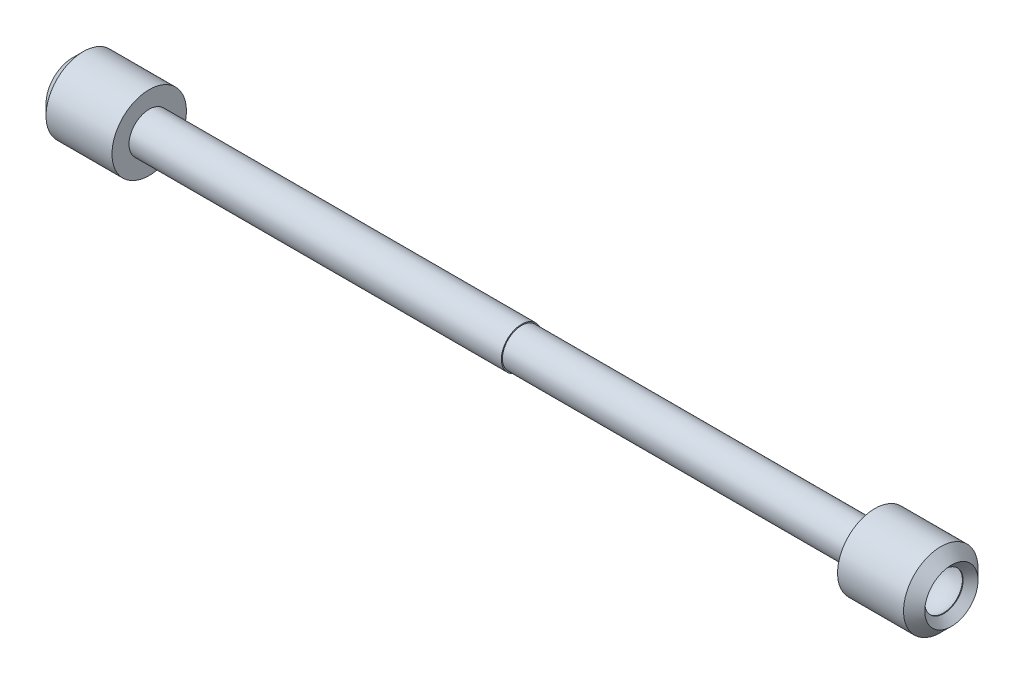
ISO-10303-21;
HEADER;
FILE_DESCRIPTION(('STEP AP214'),'2;1');
FILE_NAME('part.step','',(''),(''),'','','');
FILE_SCHEMA(('AUTOMOTIVE_DESIGN { 1 0 10303 214 1 1 1 1 }'));
ENDSEC;
DATA;
#1=APPLICATION_CONTEXT('core data for automotive mechanical design processes');
#2=APPLICATION_PROTOCOL_DEFINITION('international standard','automotive_design',2000,#1);
#3=PRODUCT_CONTEXT('',#1,'mechanical');
#4=PRODUCT('Part','Part','',(#3));
#5=PRODUCT_RELATED_PRODUCT_CATEGORY('part','',(#4));
#6=PRODUCT_DEFINITION_FORMATION('','',#4);
#7=PRODUCT_DEFINITION_CONTEXT('part definition',#1,'design');
#8=PRODUCT_DEFINITION('design','',#6,#7);
#9=PRODUCT_DEFINITION_SHAPE('','',#8);
#10=(LENGTH_UNIT() NAMED_UNIT(*) SI_UNIT(.MILLI.,.METRE.));
#11=(NAMED_UNIT(*) PLANE_ANGLE_UNIT() SI_UNIT($,.RADIAN.));
#12=(NAMED_UNIT(*) SI_UNIT($,.STERADIAN.) SOLID_ANGLE_UNIT());
#13=UNCERTAINTY_MEASURE_WITH_UNIT(LENGTH_MEASURE(1.E-05),#10,'distance_accuracy_value','');
#14=(GEOMETRIC_REPRESENTATION_CONTEXT(3) GLOBAL_UNCERTAINTY_ASSIGNED_CONTEXT((#13)) GLOBAL_UNIT_ASSIGNED_CONTEXT((#10,
#11,#12)) REPRESENTATION_CONTEXT('',''));
#15=CARTESIAN_POINT('',(0.,0.,0.));
#16=DIRECTION('',(0.,0.,1.));
#17=DIRECTION('',(1.,0.,0.));
#18=AXIS2_PLACEMENT_3D('',#15,#16,#17);
#19=CARTESIAN_POINT('',(192.,0.,0.));
#20=DIRECTION('',(1.,0.,0.));
#21=DIRECTION('',(0.,0.,-1.));
#22=AXIS2_PLACEMENT_3D('',#19,#20,#21);
#23=CYLINDRICAL_SURFACE('',#22,9.);
#24=CARTESIAN_POINT('',(198.5,0.,0.));
#25=DIRECTION('',(1.,0.,0.));
#26=DIRECTION('',(0.,0.,-1.));
#27=AXIS2_PLACEMENT_3D('',#24,#25,#26);
#28=CIRCLE('',#27,9.);
#29=CARTESIAN_POINT('',(198.5,0.,-9.));
#30=VERTEX_POINT('',#29);
#31=EDGE_CURVE('E10',#30,#30,#28,.T.);
#32=ORIENTED_EDGE('',*,*,#31,.T.);
#33=EDGE_LOOP('',(#32));
#34=FACE_BOUND('',#33,.T.);
#35=CARTESIAN_POINT('',(198.174675786449,0.,0.));
#36=DIRECTION('',(-0.999999999999999,0.,0.));
#37=DIRECTION('',(0.,0.,1.));
#38=AXIS2_PLACEMENT_3D('',#35,#36,#37);
#39=CIRCLE('',#38,9.);
#40=CARTESIAN_POINT('',(198.174675786449,0.,9.));
#41=VERTEX_POINT('',#40);
#42=EDGE_CURVE('E62',#41,#41,#39,.F.);
#43=ORIENTED_EDGE('',*,*,#42,.F.);
#44=EDGE_LOOP('',(#43));
#45=FACE_BOUND('',#44,.T.);
#46=ADVANCED_FACE('F39',(#34,#45),#23,.F.);
#47=CARTESIAN_POINT('',(166.,0.,0.));
#48=DIRECTION('',(-1.,0.,0.));
#49=DIRECTION('',(0.,0.,1.));
#50=AXIS2_PLACEMENT_3D('',#47,#48,#49);
#51=CYLINDRICAL_SURFACE('',#50,9.);
#52=CARTESIAN_POINT('',(166.,0.,0.));
#53=DIRECTION('',(1.,0.,0.));
#54=DIRECTION('',(0.,0.,-1.));
#55=AXIS2_PLACEMENT_3D('',#52,#53,#54);
#56=CIRCLE('',#55,9.);
#57=CARTESIAN_POINT('',(166.,0.,-9.));
#58=VERTEX_POINT('',#57);
#59=EDGE_CURVE('E59',#58,#58,#56,.T.);
#60=ORIENTED_EDGE('',*,*,#59,.F.);
#61=EDGE_LOOP('',(#60));
#62=FACE_BOUND('',#61,.T.);
#63=CARTESIAN_POINT('',(0.,0.,0.));
#64=DIRECTION('',(1.,0.,0.));
#65=DIRECTION('',(0.,0.,-1.));
#66=AXIS2_PLACEMENT_3D('',#63,#64,#65);
#67=CIRCLE('',#66,9.);
#68=CARTESIAN_POINT('',(0.,0.,-9.));
#69=VERTEX_POINT('',#68);
#70=EDGE_CURVE('E89',#69,#69,#67,.T.);
#71=ORIENTED_EDGE('',*,*,#70,.T.);
#72=EDGE_LOOP('',(#71));
#73=FACE_BOUND('',#72,.T.);
#74=ADVANCED_FACE('F99',(#62,#73),#51,.T.);
#75=CARTESIAN_POINT('',(-175.,0.,0.));
#76=DIRECTION('',(1.,0.,0.));
#77=DIRECTION('',(0.,0.,-1.));
#78=AXIS2_PLACEMENT_3D('',#75,#76,#77);
#79=CYLINDRICAL_SURFACE('',#78,9.5);
#80=CARTESIAN_POINT('',(-175.,0.,0.));
#81=DIRECTION('',(-1.,0.,0.));
#82=DIRECTION('',(0.,0.,1.));
#83=AXIS2_PLACEMENT_3D('',#80,#81,#82);
#84=CIRCLE('',#83,9.5);
#85=CARTESIAN_POINT('',(-175.,0.,9.5));
#86=VERTEX_POINT('',#85);
#87=EDGE_CURVE('E85',#86,#86,#84,.T.);
#88=ORIENTED_EDGE('',*,*,#87,.F.);
#89=EDGE_LOOP('',(#88));
#90=FACE_BOUND('',#89,.T.);
#91=CARTESIAN_POINT('',(0.,0.,0.));
#92=DIRECTION('',(-1.,0.,0.));
#93=DIRECTION('',(0.,0.,1.));
#94=AXIS2_PLACEMENT_3D('',#91,#92,#93);
#95=CIRCLE('',#94,9.5);
#96=CARTESIAN_POINT('',(0.,0.,9.5));
#97=VERTEX_POINT('',#96);
#98=EDGE_CURVE('E72',#97,#97,#95,.T.);
#99=ORIENTED_EDGE('',*,*,#98,.T.);
#100=EDGE_LOOP('',(#99));
#101=FACE_BOUND('',#100,.T.);
#102=ADVANCED_FACE('F105',(#90,#101),#79,.T.);
#103=CARTESIAN_POINT('',(0.,0.,0.));
#104=DIRECTION('',(-1.,0.,0.));
#105=DIRECTION('',(0.,0.,1.));
#106=AXIS2_PLACEMENT_3D('',#103,#104,#105);
#107=PLANE('',#106);
#108=ORIENTED_EDGE('',*,*,#70,.F.);
#109=EDGE_LOOP('',(#108));
#110=FACE_BOUND('',#109,.T.);
#111=ORIENTED_EDGE('',*,*,#98,.F.);
#112=EDGE_LOOP('',(#111));
#113=FACE_BOUND('',#112,.T.);
#114=ADVANCED_FACE('F101',(#110,#113),#107,.F.);
#115=CARTESIAN_POINT('',(202.,0.,0.));
#116=DIRECTION('',(-1.,0.,0.));
#117=DIRECTION('',(0.,0.,1.));
#118=AXIS2_PLACEMENT_3D('',#115,#116,#117);
#119=CYLINDRICAL_SURFACE('',#118,17.5);
#120=CARTESIAN_POINT('',(197.,0.,0.));
#121=DIRECTION('',(1.,0.,0.));
#122=DIRECTION('',(0.,0.,-1.));
#123=AXIS2_PLACEMENT_3D('',#120,#121,#122);
#124=CIRCLE('',#123,17.5);
#125=CARTESIAN_POINT('',(197.,0.,-17.5));
#126=VERTEX_POINT('',#125);
#127=EDGE_CURVE('E48',#126,#126,#124,.F.);
#128=ORIENTED_EDGE('',*,*,#127,.T.);
#129=EDGE_LOOP('',(#128));
#130=FACE_BOUND('',#129,.T.);
#131=CARTESIAN_POINT('',(166.,0.,0.));
#132=DIRECTION('',(1.,0.,0.));
#133=DIRECTION('',(0.,0.,-1.));
#134=AXIS2_PLACEMENT_3D('',#131,#132,#133);
#135=CIRCLE('',#134,17.5);
#136=CARTESIAN_POINT('',(166.,0.,-17.5));
#137=VERTEX_POINT('',#136);
#138=EDGE_CURVE('E65',#137,#137,#135,.T.);
#139=ORIENTED_EDGE('',*,*,#138,.T.);
#140=EDGE_LOOP('',(#139));
#141=FACE_BOUND('',#140,.T.);
#142=ADVANCED_FACE('F104',(#130,#141),#119,.T.);
#143=CARTESIAN_POINT('',(166.,0.,0.));
#144=DIRECTION('',(1.,0.,0.));
#145=DIRECTION('',(0.,0.,-1.));
#146=AXIS2_PLACEMENT_3D('',#143,#144,#145);
#147=PLANE('',#146);
#148=ORIENTED_EDGE('',*,*,#59,.T.);
#149=EDGE_LOOP('',(#148));
#150=FACE_BOUND('',#149,.T.);
#151=ORIENTED_EDGE('',*,*,#138,.F.);
#152=EDGE_LOOP('',(#151));
#153=FACE_BOUND('',#152,.T.);
#154=ADVANCED_FACE('F127',(#150,#153),#147,.F.);
#155=CARTESIAN_POINT('',(202.,0.,0.));
#156=DIRECTION('',(-1.,0.,0.));
#157=DIRECTION('',(0.,0.,1.));
#158=AXIS2_PLACEMENT_3D('',#155,#156,#157);
#159=CONICAL_SURFACE('',#158,12.5,0.785398163397447);
#160=ORIENTED_EDGE('',*,*,#127,.F.);
#161=EDGE_LOOP('',(#160));
#162=FACE_BOUND('',#161,.T.);
#163=CARTESIAN_POINT('',(202.,0.,0.));
#164=DIRECTION('',(1.,0.,0.));
#165=DIRECTION('',(0.,0.,-1.));
#166=AXIS2_PLACEMENT_3D('',#163,#164,#165);
#167=CIRCLE('',#166,12.5);
#168=CARTESIAN_POINT('',(202.,0.,-12.5));
#169=VERTEX_POINT('',#168);
#170=EDGE_CURVE('E53',#169,#169,#167,.T.);
#171=ORIENTED_EDGE('',*,*,#170,.F.);
#172=EDGE_LOOP('',(#171));
#173=FACE_BOUND('',#172,.T.);
#174=ADVANCED_FACE('F130',(#162,#173),#159,.T.);
#175=CARTESIAN_POINT('',(189.5,0.,0.));
#176=DIRECTION('',(0.,1.,0.));
#177=DIRECTION('',(1.,0.,0.));
#178=AXIS2_PLACEMENT_3D('',#175,#176,#177);
#179=SPHERICAL_SURFACE('',#178,12.5);
#180=CARTESIAN_POINT('',(189.5,0.,0.));
#181=DIRECTION('',(-1.,0.,0.));
#182=DIRECTION('',(0.,0.,1.));
#183=AXIS2_PLACEMENT_3D('',#180,#181,#182);
#184=SPHERICAL_SURFACE('',#183,12.5);
#185=ORIENTED_EDGE('',*,*,#42,.T.);
#186=EDGE_LOOP('',(#185));
#187=FACE_BOUND('',#186,.T.);
#188=ADVANCED_FACE('F125',(#187),#184,.F.);
#189=CARTESIAN_POINT('',(198.5,0.,0.));
#190=DIRECTION('',(1.,0.,0.));
#191=DIRECTION('',(0.,0.,-1.));
#192=AXIS2_PLACEMENT_3D('',#189,#190,#191);
#193=CONICAL_SURFACE('',#192,9.,0.785398163397453);
#194=ORIENTED_EDGE('',*,*,#170,.T.);
#195=EDGE_LOOP('',(#194));
#196=FACE_BOUND('',#195,.T.);
#197=ORIENTED_EDGE('',*,*,#31,.F.);
#198=EDGE_LOOP('',(#197));
#199=FACE_BOUND('',#198,.T.);
#200=ADVANCED_FACE('F42',(#196,#199),#193,.F.);
#201=CARTESIAN_POINT('',(-175.,0.,0.));
#202=DIRECTION('',(-1.,0.,0.));
#203=DIRECTION('',(0.,0.,-1.));
#204=AXIS2_PLACEMENT_3D('',#201,#202,#203);
#205=PLANE('',#204);
#206=ORIENTED_EDGE('',*,*,#87,.T.);
#207=EDGE_LOOP('',(#206));
#208=FACE_BOUND('',#207,.T.);
#209=CARTESIAN_POINT('',(-175.,0.,0.));
#210=DIRECTION('',(1.,0.,0.));
#211=DIRECTION('',(0.,0.,-1.));
#212=AXIS2_PLACEMENT_3D('',#209,#210,#211);
#213=CIRCLE('',#212,17.5);
#214=CARTESIAN_POINT('',(-175.,0.,-17.5));
#215=VERTEX_POINT('',#214);
#216=EDGE_CURVE('E66',#215,#215,#213,.T.);
#217=ORIENTED_EDGE('',*,*,#216,.T.);
#218=EDGE_LOOP('',(#217));
#219=FACE_BOUND('',#218,.T.);
#220=ADVANCED_FACE('F161',(#208,#219),#205,.F.);
#221=CARTESIAN_POINT('',(-211.,0.,0.));
#222=DIRECTION('',(1.,0.,0.));
#223=DIRECTION('',(0.,0.,1.));
#224=AXIS2_PLACEMENT_3D('',#221,#222,#223);
#225=CYLINDRICAL_SURFACE('',#224,17.5);
#226=CARTESIAN_POINT('',(-206.,0.,0.));
#227=DIRECTION('',(1.,0.,0.));
#228=DIRECTION('',(0.,0.,-1.));
#229=AXIS2_PLACEMENT_3D('',#226,#227,#228);
#230=CIRCLE('',#229,17.5);
#231=CARTESIAN_POINT('',(-206.,0.,-17.5));
#232=VERTEX_POINT('',#231);
#233=EDGE_CURVE('E255',#232,#232,#230,.F.);
#234=ORIENTED_EDGE('',*,*,#233,.F.);
#235=EDGE_LOOP('',(#234));
#236=FACE_BOUND('',#235,.T.);
#237=ORIENTED_EDGE('',*,*,#216,.F.);
#238=EDGE_LOOP('',(#237));
#239=FACE_BOUND('',#238,.T.);
#240=ADVANCED_FACE('F168',(#236,#239),#225,.T.);
#241=CARTESIAN_POINT('',(-201.,0.,0.));
#242=DIRECTION('',(-1.,0.,0.));
#243=DIRECTION('',(0.,0.,-1.));
#244=AXIS2_PLACEMENT_3D('',#241,#242,#243);
#245=CYLINDRICAL_SURFACE('',#244,9.);
#246=CARTESIAN_POINT('',(-207.5,0.,0.));
#247=DIRECTION('',(1.,0.,0.));
#248=DIRECTION('',(0.,0.,-1.));
#249=AXIS2_PLACEMENT_3D('',#246,#247,#248);
#250=CIRCLE('',#249,9.);
#251=CARTESIAN_POINT('',(-207.5,0.,-9.));
#252=VERTEX_POINT('',#251);
#253=EDGE_CURVE('E75',#252,#252,#250,.T.);
#254=ORIENTED_EDGE('',*,*,#253,.F.);
#255=EDGE_LOOP('',(#254));
#256=FACE_BOUND('',#255,.T.);
#257=CARTESIAN_POINT('',(-207.174675786449,0.,0.));
#258=DIRECTION('',(-0.999999999999999,0.,0.));
#259=DIRECTION('',(0.,0.,1.));
#260=AXIS2_PLACEMENT_3D('',#257,#258,#259);
#261=CIRCLE('',#260,9.);
#262=CARTESIAN_POINT('',(-207.174675786449,0.,9.));
#263=VERTEX_POINT('',#262);
#264=EDGE_CURVE('E252',#263,#263,#261,.F.);
#265=ORIENTED_EDGE('',*,*,#264,.T.);
#266=EDGE_LOOP('',(#265));
#267=FACE_BOUND('',#266,.T.);
#268=ADVANCED_FACE('F175',(#256,#267),#245,.F.);
#269=CARTESIAN_POINT('',(-207.5,0.,0.));
#270=DIRECTION('',(-1.,0.,0.));
#271=DIRECTION('',(0.,0.,-1.));
#272=AXIS2_PLACEMENT_3D('',#269,#270,#271);
#273=CONICAL_SURFACE('',#272,9.,0.785398163397453);
#274=CARTESIAN_POINT('',(-211.,0.,0.));
#275=DIRECTION('',(1.,0.,0.));
#276=DIRECTION('',(0.,0.,-1.));
#277=AXIS2_PLACEMENT_3D('',#274,#275,#276);
#278=CIRCLE('',#277,12.5);
#279=CARTESIAN_POINT('',(-211.,0.,-12.5));
#280=VERTEX_POINT('',#279);
#281=EDGE_CURVE('E81',#280,#280,#278,.T.);
#282=ORIENTED_EDGE('',*,*,#281,.F.);
#283=EDGE_LOOP('',(#282));
#284=FACE_BOUND('',#283,.T.);
#285=ORIENTED_EDGE('',*,*,#253,.T.);
#286=EDGE_LOOP('',(#285));
#287=FACE_BOUND('',#286,.T.);
#288=ADVANCED_FACE('F183',(#284,#287),#273,.F.);
#289=CARTESIAN_POINT('',(-211.,0.,0.));
#290=DIRECTION('',(1.,0.,0.));
#291=DIRECTION('',(0.,0.,1.));
#292=AXIS2_PLACEMENT_3D('',#289,#290,#291);
#293=CONICAL_SURFACE('',#292,12.5,0.785398163397447);
#294=ORIENTED_EDGE('',*,*,#233,.T.);
#295=EDGE_LOOP('',(#294));
#296=FACE_BOUND('',#295,.T.);
#297=ORIENTED_EDGE('',*,*,#281,.T.);
#298=EDGE_LOOP('',(#297));
#299=FACE_BOUND('',#298,.T.);
#300=ADVANCED_FACE('F191',(#296,#299),#293,.T.);
#301=CARTESIAN_POINT('',(-198.5,0.,0.));
#302=DIRECTION('',(0.,1.,0.));
#303=DIRECTION('',(-1.,0.,0.));
#304=AXIS2_PLACEMENT_3D('',#301,#302,#303);
#305=SPHERICAL_SURFACE('',#304,12.5);
#306=CARTESIAN_POINT('',(-198.5,0.,0.));
#307=DIRECTION('',(-1.,0.,0.));
#308=DIRECTION('',(0.,0.,1.));
#309=AXIS2_PLACEMENT_3D('',#306,#307,#308);
#310=SPHERICAL_SURFACE('',#309,12.5);
#311=ORIENTED_EDGE('',*,*,#264,.F.);
#312=EDGE_LOOP('',(#311));
#313=FACE_BOUND('',#312,.T.);
#314=ADVANCED_FACE('F199',(#313),#310,.F.);
#315=CLOSED_SHELL('',(#46,#74,#102,#114,#142,#154,#174,#188,#200,#220,#240,#268,#288,#300,#314));
#316=MANIFOLD_SOLID_BREP('B2',#315);
#317=ADVANCED_BREP_SHAPE_REPRESENTATION('',(#18,#316),#14);
#318=SHAPE_DEFINITION_REPRESENTATION(#9,#317);
ENDSEC;
END-ISO-10303-21;
